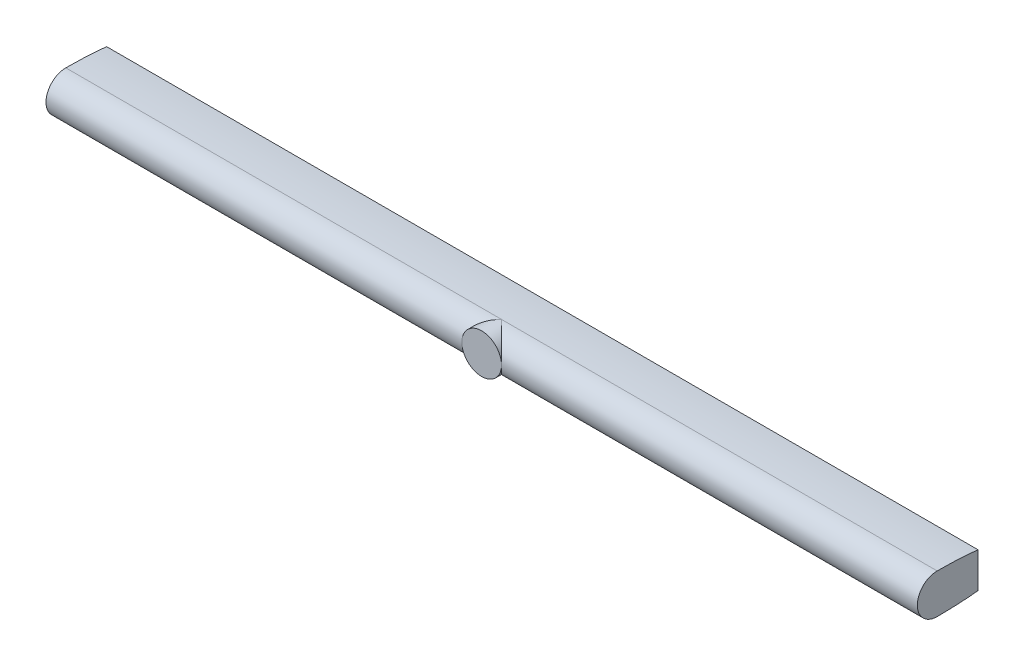
ISO-10303-21;
HEADER;
FILE_DESCRIPTION(('STEP AP214'),'2;1');
FILE_NAME('part.step','',(''),(''),'','','');
FILE_SCHEMA(('AUTOMOTIVE_DESIGN { 1 0 10303 214 1 1 1 1 }'));
ENDSEC;
DATA;
#1=APPLICATION_CONTEXT('core data for automotive mechanical design processes');
#2=APPLICATION_PROTOCOL_DEFINITION('international standard','automotive_design',2000,#1);
#3=PRODUCT_CONTEXT('',#1,'mechanical');
#4=PRODUCT('Part','Part','',(#3));
#5=PRODUCT_RELATED_PRODUCT_CATEGORY('part','',(#4));
#6=PRODUCT_DEFINITION_FORMATION('','',#4);
#7=PRODUCT_DEFINITION_CONTEXT('part definition',#1,'design');
#8=PRODUCT_DEFINITION('design','',#6,#7);
#9=PRODUCT_DEFINITION_SHAPE('','',#8);
#10=(LENGTH_UNIT() NAMED_UNIT(*) SI_UNIT(.MILLI.,.METRE.));
#11=(NAMED_UNIT(*) PLANE_ANGLE_UNIT() SI_UNIT($,.RADIAN.));
#12=(NAMED_UNIT(*) SI_UNIT($,.STERADIAN.) SOLID_ANGLE_UNIT());
#13=UNCERTAINTY_MEASURE_WITH_UNIT(LENGTH_MEASURE(1.E-05),#10,'distance_accuracy_value','');
#14=(GEOMETRIC_REPRESENTATION_CONTEXT(3) GLOBAL_UNCERTAINTY_ASSIGNED_CONTEXT((#13)) GLOBAL_UNIT_ASSIGNED_CONTEXT((#10,
#11,#12)) REPRESENTATION_CONTEXT('',''));
#15=CARTESIAN_POINT('',(0.,0.,0.));
#16=DIRECTION('',(0.,0.,1.));
#17=DIRECTION('',(1.,0.,0.));
#18=AXIS2_PLACEMENT_3D('',#15,#16,#17);
#19=CARTESIAN_POINT('',(0.,0.,29.5000000000001));
#20=DIRECTION('',(0.,0.,1.));
#21=DIRECTION('',(1.,0.,0.));
#22=AXIS2_PLACEMENT_3D('',#19,#20,#21);
#23=PLANE('',#22);
#24=CARTESIAN_POINT('',(0.,0.,29.5000000000001));
#25=DIRECTION('',(0.,0.,1.));
#26=DIRECTION('',(1.,0.,0.));
#27=AXIS2_PLACEMENT_3D('',#24,#25,#26);
#28=CIRCLE('',#27,8.);
#29=CARTESIAN_POINT('',(8.00000000000001,0.,29.5000000000001));
#30=VERTEX_POINT('',#29);
#31=CARTESIAN_POINT('',(-8.00000000000001,0.,29.5000000000001));
#32=VERTEX_POINT('',#31);
#33=EDGE_CURVE('E44',#30,#32,#28,.F.);
#34=ORIENTED_EDGE('',*,*,#33,.F.);
#35=EDGE_CURVE('E312',#32,#30,#28,.F.);
#36=ORIENTED_EDGE('',*,*,#35,.F.);
#37=EDGE_LOOP('',(#34,#36));
#38=FACE_BOUND('',#37,.T.);
#39=ADVANCED_FACE('F40',(#38),#23,.T.);
#40=CARTESIAN_POINT('',(0.,6.69328806681566E-13,15.0000000000375));
#41=DIRECTION('',(0.,0.,1.));
#42=DIRECTION('',(0.,-1.,0.));
#43=AXIS2_PLACEMENT_3D('',#40,#41,#42);
#44=PLANE('',#43);
#45=DIRECTION('',(0.,1.,0.));
#46=VECTOR('',#45,1.);
#47=CARTESIAN_POINT('',(82.5,-0.499999999999334,15.0000000000375));
#48=LINE('',#47,#46);
#49=CARTESIAN_POINT('',(82.5,-0.499999999999334,15.0000000000375));
#50=VERTEX_POINT('',#49);
#51=CARTESIAN_POINT('',(82.5,0.500000000000666,15.0000000000374));
#52=VERTEX_POINT('',#51);
#53=EDGE_CURVE('E102',#50,#52,#48,.T.);
#54=ORIENTED_EDGE('',*,*,#53,.T.);
#55=DIRECTION('',(1.,0.,0.));
#56=VECTOR('',#55,1.);
#57=CARTESIAN_POINT('',(93.5,0.500000000000666,15.0000000000374));
#58=LINE('',#57,#56);
#59=CARTESIAN_POINT('',(93.5,0.500000000000666,15.0000000000374));
#60=VERTEX_POINT('',#59);
#61=EDGE_CURVE('E111',#52,#60,#58,.T.);
#62=ORIENTED_EDGE('',*,*,#61,.T.);
#63=DIRECTION('',(0.,-1.,0.));
#64=VECTOR('',#63,1.);
#65=CARTESIAN_POINT('',(93.5,-0.499999999999334,15.0000000000375));
#66=LINE('',#65,#64);
#67=CARTESIAN_POINT('',(93.5,-0.499999999999334,15.0000000000375));
#68=VERTEX_POINT('',#67);
#69=EDGE_CURVE('E115',#60,#68,#66,.T.);
#70=ORIENTED_EDGE('',*,*,#69,.T.);
#71=DIRECTION('',(-1.,0.,0.));
#72=VECTOR('',#71,1.);
#73=CARTESIAN_POINT('',(93.5,-0.499999999999334,15.0000000000375));
#74=LINE('',#73,#72);
#75=EDGE_CURVE('E119',#68,#50,#74,.T.);
#76=ORIENTED_EDGE('',*,*,#75,.T.);
#77=EDGE_LOOP('',(#54,#62,#70,#76));
#78=FACE_BOUND('',#77,.T.);
#79=ADVANCED_FACE('F117',(#78),#44,.F.);
#80=CARTESIAN_POINT('',(0.,6.69328806681566E-13,15.0000000000375));
#81=DIRECTION('',(0.,0.,1.));
#82=DIRECTION('',(0.,-1.,0.));
#83=AXIS2_PLACEMENT_3D('',#80,#81,#82);
#84=PLANE('',#83);
#85=DIRECTION('',(0.,1.,0.));
#86=VECTOR('',#85,1.);
#87=CARTESIAN_POINT('',(-93.5,-0.499999999999334,15.0000000000375));
#88=LINE('',#87,#86);
#89=CARTESIAN_POINT('',(-93.5,-0.499999999999334,15.0000000000375));
#90=VERTEX_POINT('',#89);
#91=CARTESIAN_POINT('',(-93.5,0.500000000000666,15.0000000000374));
#92=VERTEX_POINT('',#91);
#93=EDGE_CURVE('E134',#90,#92,#88,.T.);
#94=ORIENTED_EDGE('',*,*,#93,.T.);
#95=DIRECTION('',(1.,0.,0.));
#96=VECTOR('',#95,1.);
#97=CARTESIAN_POINT('',(-82.5,0.500000000000666,15.0000000000374));
#98=LINE('',#97,#96);
#99=CARTESIAN_POINT('',(-82.5,0.500000000000666,15.0000000000374));
#100=VERTEX_POINT('',#99);
#101=EDGE_CURVE('E160',#92,#100,#98,.T.);
#102=ORIENTED_EDGE('',*,*,#101,.T.);
#103=DIRECTION('',(0.,-1.,0.));
#104=VECTOR('',#103,1.);
#105=CARTESIAN_POINT('',(-82.5,-0.499999999999334,15.0000000000375));
#106=LINE('',#105,#104);
#107=CARTESIAN_POINT('',(-82.5,-0.499999999999334,15.0000000000375));
#108=VERTEX_POINT('',#107);
#109=EDGE_CURVE('E157',#100,#108,#106,.T.);
#110=ORIENTED_EDGE('',*,*,#109,.T.);
#111=DIRECTION('',(-1.,0.,0.));
#112=VECTOR('',#111,1.);
#113=CARTESIAN_POINT('',(-82.5,-0.499999999999334,15.0000000000375));
#114=LINE('',#113,#112);
#115=EDGE_CURVE('E154',#108,#90,#114,.T.);
#116=ORIENTED_EDGE('',*,*,#115,.T.);
#117=EDGE_LOOP('',(#94,#102,#110,#116));
#118=FACE_BOUND('',#117,.T.);
#119=ADVANCED_FACE('F210',(#118),#84,.F.);
#120=CARTESIAN_POINT('',(0.,6.69328806681566E-13,15.0000000000375));
#121=DIRECTION('',(0.,0.,1.));
#122=DIRECTION('',(0.,-1.,0.));
#123=AXIS2_PLACEMENT_3D('',#120,#121,#122);
#124=PLANE('',#123);
#125=DIRECTION('',(0.,1.,0.));
#126=VECTOR('',#125,1.);
#127=CARTESIAN_POINT('',(-5.50000000000001,-0.499999999999334,15.0000000000375));
#128=LINE('',#127,#126);
#129=CARTESIAN_POINT('',(-5.50000000000001,-0.499999999999334,15.0000000000375));
#130=VERTEX_POINT('',#129);
#131=CARTESIAN_POINT('',(-5.50000000000001,0.500000000000666,15.0000000000374));
#132=VERTEX_POINT('',#131);
#133=EDGE_CURVE('E120',#130,#132,#128,.T.);
#134=ORIENTED_EDGE('',*,*,#133,.T.);
#135=DIRECTION('',(1.,0.,0.));
#136=VECTOR('',#135,1.);
#137=CARTESIAN_POINT('',(5.50000000000001,0.500000000000666,15.0000000000374));
#138=LINE('',#137,#136);
#139=CARTESIAN_POINT('',(5.50000000000001,0.500000000000666,15.0000000000374));
#140=VERTEX_POINT('',#139);
#141=EDGE_CURVE('E122',#132,#140,#138,.T.);
#142=ORIENTED_EDGE('',*,*,#141,.T.);
#143=DIRECTION('',(0.,-1.,0.));
#144=VECTOR('',#143,1.);
#145=CARTESIAN_POINT('',(5.50000000000001,-0.499999999999334,15.0000000000375));
#146=LINE('',#145,#144);
#147=CARTESIAN_POINT('',(5.50000000000001,-0.499999999999334,15.0000000000375));
#148=VERTEX_POINT('',#147);
#149=EDGE_CURVE('E144',#140,#148,#146,.T.);
#150=ORIENTED_EDGE('',*,*,#149,.T.);
#151=DIRECTION('',(-1.,0.,0.));
#152=VECTOR('',#151,1.);
#153=CARTESIAN_POINT('',(5.50000000000001,-0.499999999999334,15.0000000000375));
#154=LINE('',#153,#152);
#155=EDGE_CURVE('E141',#148,#130,#154,.T.);
#156=ORIENTED_EDGE('',*,*,#155,.T.);
#157=EDGE_LOOP('',(#134,#142,#150,#156));
#158=FACE_BOUND('',#157,.T.);
#159=ADVANCED_FACE('F213',(#158),#124,.F.);
#160=CARTESIAN_POINT('',(93.5,0.499999999999645,-7.99999999996257));
#161=DIRECTION('',(0.,-1.,0.));
#162=DIRECTION('',(0.,0.,-1.));
#163=AXIS2_PLACEMENT_3D('',#160,#161,#162);
#164=PLANE('',#163);
#165=DIRECTION('',(1.,0.,0.));
#166=VECTOR('',#165,1.);
#167=CARTESIAN_POINT('',(-192.917832605124,0.500000000000222,5.00000000003743));
#168=LINE('',#167,#166);
#169=CARTESIAN_POINT('',(82.5,0.500000000000222,5.00000000003743));
#170=VERTEX_POINT('',#169);
#171=CARTESIAN_POINT('',(93.5,0.500000000000222,5.00000000003745));
#172=VERTEX_POINT('',#171);
#173=EDGE_CURVE('E370',#170,#172,#168,.T.);
#174=ORIENTED_EDGE('',*,*,#173,.T.);
#175=DIRECTION('',(0.,0.,1.));
#176=VECTOR('',#175,1.);
#177=CARTESIAN_POINT('',(93.5,0.499999999999645,-7.99999999996257));
#178=LINE('',#177,#176);
#179=EDGE_CURVE('E91',#172,#60,#178,.T.);
#180=ORIENTED_EDGE('',*,*,#179,.T.);
#181=ORIENTED_EDGE('',*,*,#61,.F.);
#182=DIRECTION('',(0.,0.,1.));
#183=VECTOR('',#182,1.);
#184=CARTESIAN_POINT('',(82.5,0.499999999999645,-7.99999999996257));
#185=LINE('',#184,#183);
#186=EDGE_CURVE('E98',#170,#52,#185,.T.);
#187=ORIENTED_EDGE('',*,*,#186,.F.);
#188=EDGE_LOOP('',(#174,#180,#181,#187));
#189=FACE_BOUND('',#188,.T.);
#190=ADVANCED_FACE('F112',(#189),#164,.T.);
#191=CARTESIAN_POINT('',(93.5,-0.500000000000355,-7.99999999996252));
#192=DIRECTION('',(-1.,0.,0.));
#193=DIRECTION('',(0.,0.,1.));
#194=AXIS2_PLACEMENT_3D('',#191,#192,#193);
#195=PLANE('',#194);
#196=DIRECTION('',(0.,-1.,0.));
#197=VECTOR('',#196,1.);
#198=CARTESIAN_POINT('',(93.5,-7.1626297578272,5.00000000003777));
#199=LINE('',#198,#197);
#200=CARTESIAN_POINT('',(93.5,-0.499999999999778,5.00000000003748));
#201=VERTEX_POINT('',#200);
#202=EDGE_CURVE('E367',#172,#201,#199,.T.);
#203=ORIENTED_EDGE('',*,*,#202,.T.);
#204=DIRECTION('',(0.,0.,1.));
#205=VECTOR('',#204,1.);
#206=CARTESIAN_POINT('',(93.5,-0.500000000000355,-7.99999999996252));
#207=LINE('',#206,#205);
#208=EDGE_CURVE('E129',#201,#68,#207,.T.);
#209=ORIENTED_EDGE('',*,*,#208,.T.);
#210=ORIENTED_EDGE('',*,*,#69,.F.);
#211=ORIENTED_EDGE('',*,*,#179,.F.);
#212=EDGE_LOOP('',(#203,#209,#210,#211));
#213=FACE_BOUND('',#212,.T.);
#214=ADVANCED_FACE('F255',(#213),#195,.T.);
#215=CARTESIAN_POINT('',(93.5,-0.500000000000355,-7.99999999996252));
#216=DIRECTION('',(0.,1.,0.));
#217=DIRECTION('',(0.,0.,1.));
#218=AXIS2_PLACEMENT_3D('',#215,#216,#217);
#219=PLANE('',#218);
#220=DIRECTION('',(-1.,0.,0.));
#221=VECTOR('',#220,1.);
#222=CARTESIAN_POINT('',(-192.917832605124,-0.499999999999778,5.00000000003748));
#223=LINE('',#222,#221);
#224=CARTESIAN_POINT('',(82.5,-0.499999999999778,5.00000000003747));
#225=VERTEX_POINT('',#224);
#226=EDGE_CURVE('E364',#201,#225,#223,.T.);
#227=ORIENTED_EDGE('',*,*,#226,.T.);
#228=DIRECTION('',(0.,0.,1.));
#229=VECTOR('',#228,1.);
#230=CARTESIAN_POINT('',(82.5,-0.500000000000355,-7.99999999996252));
#231=LINE('',#230,#229);
#232=EDGE_CURVE('E127',#225,#50,#231,.T.);
#233=ORIENTED_EDGE('',*,*,#232,.T.);
#234=ORIENTED_EDGE('',*,*,#75,.F.);
#235=ORIENTED_EDGE('',*,*,#208,.F.);
#236=EDGE_LOOP('',(#227,#233,#234,#235));
#237=FACE_BOUND('',#236,.T.);
#238=ADVANCED_FACE('F252',(#237),#219,.T.);
#239=CARTESIAN_POINT('',(82.5,-0.500000000000355,-7.99999999996252));
#240=DIRECTION('',(1.,0.,0.));
#241=DIRECTION('',(0.,0.,-1.));
#242=AXIS2_PLACEMENT_3D('',#239,#240,#241);
#243=PLANE('',#242);
#244=DIRECTION('',(0.,1.,0.));
#245=VECTOR('',#244,1.);
#246=CARTESIAN_POINT('',(82.5,-7.1626297578272,5.00000000003777));
#247=LINE('',#246,#245);
#248=EDGE_CURVE('E106',#225,#170,#247,.T.);
#249=ORIENTED_EDGE('',*,*,#248,.T.);
#250=ORIENTED_EDGE('',*,*,#186,.T.);
#251=ORIENTED_EDGE('',*,*,#53,.F.);
#252=ORIENTED_EDGE('',*,*,#232,.F.);
#253=EDGE_LOOP('',(#249,#250,#251,#252));
#254=FACE_BOUND('',#253,.T.);
#255=ADVANCED_FACE('F99',(#254),#243,.T.);
#256=CARTESIAN_POINT('',(-82.5,0.499999999999645,-7.99999999996257));
#257=DIRECTION('',(0.,-1.,0.));
#258=DIRECTION('',(0.,0.,-1.));
#259=AXIS2_PLACEMENT_3D('',#256,#257,#258);
#260=PLANE('',#259);
#261=DIRECTION('',(1.,0.,0.));
#262=VECTOR('',#261,1.);
#263=CARTESIAN_POINT('',(-192.917832605124,0.500000000000222,5.00000000003743));
#264=LINE('',#263,#262);
#265=CARTESIAN_POINT('',(-93.5,0.500000000000222,5.00000000003743));
#266=VERTEX_POINT('',#265);
#267=CARTESIAN_POINT('',(-82.5,0.500000000000222,5.00000000003745));
#268=VERTEX_POINT('',#267);
#269=EDGE_CURVE('E344',#266,#268,#264,.T.);
#270=ORIENTED_EDGE('',*,*,#269,.T.);
#271=DIRECTION('',(0.,0.,1.));
#272=VECTOR('',#271,1.);
#273=CARTESIAN_POINT('',(-82.5,0.499999999999645,-7.99999999996257));
#274=LINE('',#273,#272);
#275=EDGE_CURVE('E50',#268,#100,#274,.T.);
#276=ORIENTED_EDGE('',*,*,#275,.T.);
#277=ORIENTED_EDGE('',*,*,#101,.F.);
#278=DIRECTION('',(0.,0.,1.));
#279=VECTOR('',#278,1.);
#280=CARTESIAN_POINT('',(-93.5,0.499999999999645,-7.99999999996257));
#281=LINE('',#280,#279);
#282=EDGE_CURVE('E11',#266,#92,#281,.T.);
#283=ORIENTED_EDGE('',*,*,#282,.F.);
#284=EDGE_LOOP('',(#270,#276,#277,#283));
#285=FACE_BOUND('',#284,.T.);
#286=ADVANCED_FACE('F222',(#285),#260,.T.);
#287=CARTESIAN_POINT('',(-82.5,-0.500000000000355,-7.99999999996252));
#288=DIRECTION('',(-1.,0.,0.));
#289=DIRECTION('',(0.,0.,1.));
#290=AXIS2_PLACEMENT_3D('',#287,#288,#289);
#291=PLANE('',#290);
#292=DIRECTION('',(0.,-1.,0.));
#293=VECTOR('',#292,1.);
#294=CARTESIAN_POINT('',(-82.5,-7.1626297578272,5.00000000003777));
#295=LINE('',#294,#293);
#296=CARTESIAN_POINT('',(-82.5,-0.499999999999778,5.00000000003748));
#297=VERTEX_POINT('',#296);
#298=EDGE_CURVE('E340',#268,#297,#295,.T.);
#299=ORIENTED_EDGE('',*,*,#298,.T.);
#300=DIRECTION('',(0.,0.,1.));
#301=VECTOR('',#300,1.);
#302=CARTESIAN_POINT('',(-82.5,-0.500000000000355,-7.99999999996252));
#303=LINE('',#302,#301);
#304=EDGE_CURVE('E151',#297,#108,#303,.T.);
#305=ORIENTED_EDGE('',*,*,#304,.T.);
#306=ORIENTED_EDGE('',*,*,#109,.F.);
#307=ORIENTED_EDGE('',*,*,#275,.F.);
#308=EDGE_LOOP('',(#299,#305,#306,#307));
#309=FACE_BOUND('',#308,.T.);
#310=ADVANCED_FACE('F219',(#309),#291,.T.);
#311=CARTESIAN_POINT('',(-82.5,-0.500000000000355,-7.99999999996252));
#312=DIRECTION('',(0.,1.,0.));
#313=DIRECTION('',(0.,0.,1.));
#314=AXIS2_PLACEMENT_3D('',#311,#312,#313);
#315=PLANE('',#314);
#316=DIRECTION('',(-1.,0.,0.));
#317=VECTOR('',#316,1.);
#318=CARTESIAN_POINT('',(-192.917832605124,-0.499999999999778,5.00000000003748));
#319=LINE('',#318,#317);
#320=CARTESIAN_POINT('',(-93.5,-0.499999999999778,5.00000000003747));
#321=VERTEX_POINT('',#320);
#322=EDGE_CURVE('E335',#297,#321,#319,.T.);
#323=ORIENTED_EDGE('',*,*,#322,.T.);
#324=DIRECTION('',(0.,0.,1.));
#325=VECTOR('',#324,1.);
#326=CARTESIAN_POINT('',(-93.5,-0.500000000000355,-7.99999999996252));
#327=LINE('',#326,#325);
#328=EDGE_CURVE('E59',#321,#90,#327,.T.);
#329=ORIENTED_EDGE('',*,*,#328,.T.);
#330=ORIENTED_EDGE('',*,*,#115,.F.);
#331=ORIENTED_EDGE('',*,*,#304,.F.);
#332=EDGE_LOOP('',(#323,#329,#330,#331));
#333=FACE_BOUND('',#332,.T.);
#334=ADVANCED_FACE('F215',(#333),#315,.T.);
#335=CARTESIAN_POINT('',(-93.5,-0.500000000000355,-7.99999999996252));
#336=DIRECTION('',(1.,0.,0.));
#337=DIRECTION('',(0.,0.,-1.));
#338=AXIS2_PLACEMENT_3D('',#335,#336,#337);
#339=PLANE('',#338);
#340=DIRECTION('',(0.,1.,0.));
#341=VECTOR('',#340,1.);
#342=CARTESIAN_POINT('',(-93.5,-7.1626297578272,5.00000000003777));
#343=LINE('',#342,#341);
#344=EDGE_CURVE('E349',#321,#266,#343,.T.);
#345=ORIENTED_EDGE('',*,*,#344,.T.);
#346=ORIENTED_EDGE('',*,*,#282,.T.);
#347=ORIENTED_EDGE('',*,*,#93,.F.);
#348=ORIENTED_EDGE('',*,*,#328,.F.);
#349=EDGE_LOOP('',(#345,#346,#347,#348));
#350=FACE_BOUND('',#349,.T.);
#351=ADVANCED_FACE('F218',(#350),#339,.T.);
#352=CARTESIAN_POINT('',(5.50000000000001,0.499999999999645,-7.99999999996257));
#353=DIRECTION('',(0.,-1.,0.));
#354=DIRECTION('',(0.,0.,-1.));
#355=AXIS2_PLACEMENT_3D('',#352,#353,#354);
#356=PLANE('',#355);
#357=DIRECTION('',(1.,0.,0.));
#358=VECTOR('',#357,1.);
#359=CARTESIAN_POINT('',(-192.917832605124,0.500000000000222,5.00000000003743));
#360=LINE('',#359,#358);
#361=CARTESIAN_POINT('',(-5.50000000000001,0.500000000000222,5.00000000003743));
#362=VERTEX_POINT('',#361);
#363=CARTESIAN_POINT('',(5.50000000000001,0.500000000000222,5.00000000003745));
#364=VERTEX_POINT('',#363);
#365=EDGE_CURVE('E358',#362,#364,#360,.T.);
#366=ORIENTED_EDGE('',*,*,#365,.T.);
#367=DIRECTION('',(0.,0.,1.));
#368=VECTOR('',#367,1.);
#369=CARTESIAN_POINT('',(5.50000000000001,0.499999999999645,-7.99999999996257));
#370=LINE('',#369,#368);
#371=EDGE_CURVE('E135',#364,#140,#370,.T.);
#372=ORIENTED_EDGE('',*,*,#371,.T.);
#373=ORIENTED_EDGE('',*,*,#141,.F.);
#374=DIRECTION('',(0.,0.,1.));
#375=VECTOR('',#374,1.);
#376=CARTESIAN_POINT('',(-5.50000000000001,0.499999999999645,-7.99999999996257));
#377=LINE('',#376,#375);
#378=EDGE_CURVE('E132',#362,#132,#377,.T.);
#379=ORIENTED_EDGE('',*,*,#378,.F.);
#380=EDGE_LOOP('',(#366,#372,#373,#379));
#381=FACE_BOUND('',#380,.T.);
#382=ADVANCED_FACE('F229',(#381),#356,.T.);
#383=CARTESIAN_POINT('',(5.50000000000001,-0.500000000000355,-7.99999999996252));
#384=DIRECTION('',(-1.,0.,0.));
#385=DIRECTION('',(0.,0.,1.));
#386=AXIS2_PLACEMENT_3D('',#383,#384,#385);
#387=PLANE('',#386);
#388=DIRECTION('',(0.,-1.,0.));
#389=VECTOR('',#388,1.);
#390=CARTESIAN_POINT('',(5.50000000000001,-7.1626297578272,5.00000000003777));
#391=LINE('',#390,#389);
#392=CARTESIAN_POINT('',(5.50000000000001,-0.499999999999778,5.00000000003748));
#393=VERTEX_POINT('',#392);
#394=EDGE_CURVE('E355',#364,#393,#391,.T.);
#395=ORIENTED_EDGE('',*,*,#394,.T.);
#396=DIRECTION('',(0.,0.,1.));
#397=VECTOR('',#396,1.);
#398=CARTESIAN_POINT('',(5.50000000000001,-0.500000000000355,-7.99999999996252));
#399=LINE('',#398,#397);
#400=EDGE_CURVE('E137',#393,#148,#399,.T.);
#401=ORIENTED_EDGE('',*,*,#400,.T.);
#402=ORIENTED_EDGE('',*,*,#149,.F.);
#403=ORIENTED_EDGE('',*,*,#371,.F.);
#404=EDGE_LOOP('',(#395,#401,#402,#403));
#405=FACE_BOUND('',#404,.T.);
#406=ADVANCED_FACE('F238',(#405),#387,.T.);
#407=CARTESIAN_POINT('',(5.50000000000001,-0.500000000000355,-7.99999999996252));
#408=DIRECTION('',(0.,1.,0.));
#409=DIRECTION('',(0.,0.,1.));
#410=AXIS2_PLACEMENT_3D('',#407,#408,#409);
#411=PLANE('',#410);
#412=DIRECTION('',(-1.,0.,0.));
#413=VECTOR('',#412,1.);
#414=CARTESIAN_POINT('',(-192.917832605124,-0.499999999999778,5.00000000003748));
#415=LINE('',#414,#413);
#416=CARTESIAN_POINT('',(-5.50000000000001,-0.499999999999778,5.00000000003747));
#417=VERTEX_POINT('',#416);
#418=EDGE_CURVE('E352',#393,#417,#415,.T.);
#419=ORIENTED_EDGE('',*,*,#418,.T.);
#420=DIRECTION('',(0.,0.,1.));
#421=VECTOR('',#420,1.);
#422=CARTESIAN_POINT('',(-5.50000000000001,-0.500000000000355,-7.99999999996252));
#423=LINE('',#422,#421);
#424=EDGE_CURVE('E139',#417,#130,#423,.T.);
#425=ORIENTED_EDGE('',*,*,#424,.T.);
#426=ORIENTED_EDGE('',*,*,#155,.F.);
#427=ORIENTED_EDGE('',*,*,#400,.F.);
#428=EDGE_LOOP('',(#419,#425,#426,#427));
#429=FACE_BOUND('',#428,.T.);
#430=ADVANCED_FACE('F234',(#429),#411,.T.);
#431=CARTESIAN_POINT('',(-5.50000000000001,-0.500000000000355,-7.99999999996252));
#432=DIRECTION('',(1.,0.,0.));
#433=DIRECTION('',(0.,0.,-1.));
#434=AXIS2_PLACEMENT_3D('',#431,#432,#433);
#435=PLANE('',#434);
#436=DIRECTION('',(0.,1.,0.));
#437=VECTOR('',#436,1.);
#438=CARTESIAN_POINT('',(-5.50000000000001,-7.1626297578272,5.00000000003777));
#439=LINE('',#438,#437);
#440=EDGE_CURVE('E361',#417,#362,#439,.T.);
#441=ORIENTED_EDGE('',*,*,#440,.T.);
#442=ORIENTED_EDGE('',*,*,#378,.T.);
#443=ORIENTED_EDGE('',*,*,#133,.F.);
#444=ORIENTED_EDGE('',*,*,#424,.F.);
#445=EDGE_LOOP('',(#441,#442,#443,#444));
#446=FACE_BOUND('',#445,.T.);
#447=ADVANCED_FACE('F237',(#446),#435,.T.);
#448=CARTESIAN_POINT('',(-192.917832605124,-7.1626297578272,5.00000000003777));
#449=DIRECTION('',(0.,0.,1.));
#450=DIRECTION('',(0.,-1.,0.));
#451=AXIS2_PLACEMENT_3D('',#448,#449,#450);
#452=PLANE('',#451);
#453=ORIENTED_EDGE('',*,*,#440,.F.);
#454=ORIENTED_EDGE('',*,*,#418,.F.);
#455=ORIENTED_EDGE('',*,*,#394,.F.);
#456=ORIENTED_EDGE('',*,*,#365,.F.);
#457=EDGE_LOOP('',(#453,#454,#455,#456));
#458=FACE_BOUND('',#457,.T.);
#459=DIRECTION('',(0.,1.,0.));
#460=VECTOR('',#459,1.);
#461=CARTESIAN_POINT('',(-176.,-7.1626297578272,5.00000000003777));
#462=LINE('',#461,#460);
#463=CARTESIAN_POINT('',(-176.,-7.16262975778915,5.00000000003775));
#464=VERTEX_POINT('',#463);
#465=CARTESIAN_POINT('',(-176.,7.16262975788814,5.00000000003714));
#466=VERTEX_POINT('',#465);
#467=EDGE_CURVE('E171',#464,#466,#462,.T.);
#468=ORIENTED_EDGE('',*,*,#467,.T.);
#469=DIRECTION('',(1.,0.,0.));
#470=VECTOR('',#469,1.);
#471=CARTESIAN_POINT('',(-192.917832605124,7.16262975788814,5.00000000003714));
#472=LINE('',#471,#470);
#473=CARTESIAN_POINT('',(176.,7.16262975788814,5.00000000003714));
#474=VERTEX_POINT('',#473);
#475=EDGE_CURVE('E329',#466,#474,#472,.T.);
#476=ORIENTED_EDGE('',*,*,#475,.T.);
#477=DIRECTION('',(0.,-1.,0.));
#478=VECTOR('',#477,1.);
#479=CARTESIAN_POINT('',(176.,-7.1626297578272,5.00000000003777));
#480=LINE('',#479,#478);
#481=CARTESIAN_POINT('',(176.,-7.16262975299486,4.99999995242817));
#482=VERTEX_POINT('',#481);
#483=EDGE_CURVE('E332',#474,#482,#480,.T.);
#484=ORIENTED_EDGE('',*,*,#483,.T.);
#485=DIRECTION('',(1.,0.,0.));
#486=VECTOR('',#485,1.);
#487=CARTESIAN_POINT('',(-192.917832605124,-7.16262975299486,4.99999995242817));
#488=LINE('',#487,#486);
#489=EDGE_CURVE('E181',#464,#482,#488,.T.);
#490=ORIENTED_EDGE('',*,*,#489,.F.);
#491=EDGE_LOOP('',(#468,#476,#484,#490));
#492=FACE_BOUND('',#491,.T.);
#493=ORIENTED_EDGE('',*,*,#344,.F.);
#494=ORIENTED_EDGE('',*,*,#322,.F.);
#495=ORIENTED_EDGE('',*,*,#298,.F.);
#496=ORIENTED_EDGE('',*,*,#269,.F.);
#497=EDGE_LOOP('',(#493,#494,#495,#496));
#498=FACE_BOUND('',#497,.T.);
#499=ORIENTED_EDGE('',*,*,#248,.F.);
#500=ORIENTED_EDGE('',*,*,#226,.F.);
#501=ORIENTED_EDGE('',*,*,#202,.F.);
#502=ORIENTED_EDGE('',*,*,#173,.F.);
#503=EDGE_LOOP('',(#499,#500,#501,#502));
#504=FACE_BOUND('',#503,.T.);
#505=ADVANCED_FACE('F248',(#458,#492,#498,#504),#452,.F.);
#506=CARTESIAN_POINT('',(176.,-8.,21.5000000000001));
#507=CARTESIAN_POINT('',(176.,-7.99999999999967,-3.99999999999997));
#508=CARTESIAN_POINT('',(176.,0.,-29.5));
#509=B_SPLINE_CURVE_WITH_KNOTS('',2,(#506,#507,#508),.UNSPECIFIED.,.F.,.F.,(3,3),(0.,1.),.UNSPECIFIED.);
#510=DIRECTION('',(-1.,0.,0.));
#511=VECTOR('',#510,1.);
#512=SURFACE_OF_LINEAR_EXTRUSION('',#509,#511);
#513=CARTESIAN_POINT('',(-176.,-8.,21.5000000000001));
#514=CARTESIAN_POINT('',(-176.,-7.99999999999967,-3.99999999999997));
#515=CARTESIAN_POINT('',(-176.,0.,-29.5));
#516=B_SPLINE_CURVE_WITH_KNOTS('',2,(#513,#514,#515),.UNSPECIFIED.,.F.,.F.,(3,3),(0.,1.),.UNSPECIFIED.);
#517=CARTESIAN_POINT('',(-176.,-8.,21.5000000000001));
#518=VERTEX_POINT('',#517);
#519=EDGE_CURVE('E172',#518,#464,#516,.T.);
#520=ORIENTED_EDGE('',*,*,#519,.T.);
#521=ORIENTED_EDGE('',*,*,#489,.T.);
#522=CARTESIAN_POINT('',(176.,-8.,21.5000000000001));
#523=VERTEX_POINT('',#522);
#524=EDGE_CURVE('E170',#523,#482,#509,.T.);
#525=ORIENTED_EDGE('',*,*,#524,.F.);
#526=DIRECTION('',(-1.,0.,0.));
#527=VECTOR('',#526,1.);
#528=CARTESIAN_POINT('',(176.,-8.,21.5000000000001));
#529=LINE('',#528,#527);
#530=CARTESIAN_POINT('',(0.,-8.,21.5000000000001));
#531=VERTEX_POINT('',#530);
#532=EDGE_CURVE('E319',#523,#531,#529,.T.);
#533=ORIENTED_EDGE('',*,*,#532,.T.);
#534=EDGE_CURVE('E299',#531,#518,#529,.T.);
#535=ORIENTED_EDGE('',*,*,#534,.T.);
#536=EDGE_LOOP('',(#520,#521,#525,#533,#535));
#537=FACE_BOUND('',#536,.T.);
#538=ADVANCED_FACE('F208',(#537),#512,.F.);
#539=CARTESIAN_POINT('',(-176.,5.99999999999984,-3.99999999999997));
#540=DIRECTION('',(1.,0.,0.));
#541=DIRECTION('',(0.,0.,-1.));
#542=AXIS2_PLACEMENT_3D('',#539,#540,#541);
#543=PLANE('',#542);
#544=CARTESIAN_POINT('',(-176.,8.,21.5000000000001));
#545=CARTESIAN_POINT('',(-176.,7.99999999999967,-3.99999999999997));
#546=CARTESIAN_POINT('',(-176.,0.,-29.5));
#547=B_SPLINE_CURVE_WITH_KNOTS('',2,(#544,#545,#546),.UNSPECIFIED.,.F.,.F.,(3,3),(0.,1.),.UNSPECIFIED.);
#548=CARTESIAN_POINT('',(-176.,8.,21.5000000000001));
#549=VERTEX_POINT('',#548);
#550=EDGE_CURVE('E165',#549,#466,#547,.T.);
#551=ORIENTED_EDGE('',*,*,#550,.T.);
#552=ORIENTED_EDGE('',*,*,#467,.F.);
#553=ORIENTED_EDGE('',*,*,#519,.F.);
#554=CARTESIAN_POINT('',(-176.,0.,21.5000000000001));
#555=DIRECTION('',(1.,0.,0.));
#556=DIRECTION('',(0.,0.,-1.));
#557=AXIS2_PLACEMENT_3D('',#554,#555,#556);
#558=CIRCLE('',#557,8.);
#559=EDGE_CURVE('E180',#549,#518,#558,.T.);
#560=ORIENTED_EDGE('',*,*,#559,.F.);
#561=EDGE_LOOP('',(#551,#552,#553,#560));
#562=FACE_BOUND('',#561,.T.);
#563=ADVANCED_FACE('F284',(#562),#543,.F.);
#564=CARTESIAN_POINT('',(0.,0.,-29.501));
#565=DIRECTION('',(0.,0.,1.));
#566=DIRECTION('',(1.,0.,0.));
#567=AXIS2_PLACEMENT_3D('',#564,#565,#566);
#568=CYLINDRICAL_SURFACE('',#567,8.);
#569=CARTESIAN_POINT('',(0.,0.,21.5000000000001));
#570=DIRECTION('',(-0.707106781186547,0.,0.707106781186547));
#571=DIRECTION('',(0.707106781186547,0.,0.707106781186547));
#572=AXIS2_PLACEMENT_3D('',#569,#570,#571);
#573=ELLIPSE('',#572,11.3137084989848,8.);
#574=EDGE_CURVE('E315',#531,#30,#573,.T.);
#575=ORIENTED_EDGE('',*,*,#574,.T.);
#576=ORIENTED_EDGE('',*,*,#33,.T.);
#577=CARTESIAN_POINT('',(0.,0.,21.5000000000001));
#578=DIRECTION('',(0.707106781186547,0.,0.707106781186547));
#579=DIRECTION('',(-0.707106781186547,0.,0.707106781186547));
#580=AXIS2_PLACEMENT_3D('',#577,#578,#579);
#581=ELLIPSE('',#580,11.3137084989848,8.);
#582=EDGE_CURVE('E108',#32,#531,#581,.T.);
#583=ORIENTED_EDGE('',*,*,#582,.T.);
#584=EDGE_LOOP('',(#575,#576,#583));
#585=FACE_BOUND('',#584,.T.);
#586=ADVANCED_FACE('F42',(#585),#568,.T.);
#587=CARTESIAN_POINT('',(176.,0.,21.5000000000001));
#588=DIRECTION('',(-1.,0.,0.));
#589=DIRECTION('',(0.,0.,1.));
#590=AXIS2_PLACEMENT_3D('',#587,#588,#589);
#591=CYLINDRICAL_SURFACE('',#590,8.);
#592=ORIENTED_EDGE('',*,*,#582,.F.);
#593=CARTESIAN_POINT('',(0.,8.,21.5000000000001));
#594=VERTEX_POINT('',#593);
#595=EDGE_CURVE('E294',#594,#32,#581,.T.);
#596=ORIENTED_EDGE('',*,*,#595,.F.);
#597=DIRECTION('',(-1.,0.,0.));
#598=VECTOR('',#597,1.);
#599=CARTESIAN_POINT('',(176.,8.,21.5000000000001));
#600=LINE('',#599,#598);
#601=EDGE_CURVE('E192',#594,#549,#600,.T.);
#602=ORIENTED_EDGE('',*,*,#601,.T.);
#603=ORIENTED_EDGE('',*,*,#559,.T.);
#604=ORIENTED_EDGE('',*,*,#534,.F.);
#605=EDGE_LOOP('',(#592,#596,#602,#603,#604));
#606=FACE_BOUND('',#605,.T.);
#607=ADVANCED_FACE('F206',(#606),#591,.T.);
#608=CARTESIAN_POINT('',(176.,8.,21.5000000000001));
#609=CARTESIAN_POINT('',(176.,7.99999999999967,-3.99999999999997));
#610=CARTESIAN_POINT('',(176.,0.,-29.5));
#611=B_SPLINE_CURVE_WITH_KNOTS('',2,(#608,#609,#610),.UNSPECIFIED.,.F.,.F.,(3,3),(0.,1.),.UNSPECIFIED.);
#612=DIRECTION('',(-1.,0.,0.));
#613=VECTOR('',#612,1.);
#614=SURFACE_OF_LINEAR_EXTRUSION('',#611,#613);
#615=ORIENTED_EDGE('',*,*,#475,.F.);
#616=ORIENTED_EDGE('',*,*,#550,.F.);
#617=ORIENTED_EDGE('',*,*,#601,.F.);
#618=CARTESIAN_POINT('',(176.,8.,21.5000000000001));
#619=VERTEX_POINT('',#618);
#620=EDGE_CURVE('E191',#619,#594,#600,.T.);
#621=ORIENTED_EDGE('',*,*,#620,.F.);
#622=EDGE_CURVE('E182',#619,#474,#611,.T.);
#623=ORIENTED_EDGE('',*,*,#622,.T.);
#624=EDGE_LOOP('',(#615,#616,#617,#621,#623));
#625=FACE_BOUND('',#624,.T.);
#626=ADVANCED_FACE('F201',(#625),#614,.T.);
#627=ORIENTED_EDGE('',*,*,#595,.T.);
#628=ORIENTED_EDGE('',*,*,#35,.T.);
#629=EDGE_CURVE('E314',#30,#594,#573,.T.);
#630=ORIENTED_EDGE('',*,*,#629,.T.);
#631=EDGE_LOOP('',(#627,#628,#630));
#632=FACE_BOUND('',#631,.T.);
#633=ADVANCED_FACE('F205',(#632),#568,.T.);
#634=CARTESIAN_POINT('',(176.,5.99999999999984,-3.99999999999997));
#635=DIRECTION('',(1.,0.,0.));
#636=DIRECTION('',(0.,0.,-1.));
#637=AXIS2_PLACEMENT_3D('',#634,#635,#636);
#638=PLANE('',#637);
#639=ORIENTED_EDGE('',*,*,#483,.F.);
#640=ORIENTED_EDGE('',*,*,#622,.F.);
#641=CARTESIAN_POINT('',(176.,0.,21.5000000000001));
#642=DIRECTION('',(1.,0.,0.));
#643=DIRECTION('',(0.,0.,-1.));
#644=AXIS2_PLACEMENT_3D('',#641,#642,#643);
#645=CIRCLE('',#644,8.);
#646=EDGE_CURVE('E324',#619,#523,#645,.T.);
#647=ORIENTED_EDGE('',*,*,#646,.T.);
#648=ORIENTED_EDGE('',*,*,#524,.T.);
#649=EDGE_LOOP('',(#639,#640,#647,#648));
#650=FACE_BOUND('',#649,.T.);
#651=ADVANCED_FACE('F270',(#650),#638,.T.);
#652=ORIENTED_EDGE('',*,*,#532,.F.);
#653=ORIENTED_EDGE('',*,*,#646,.F.);
#654=ORIENTED_EDGE('',*,*,#620,.T.);
#655=ORIENTED_EDGE('',*,*,#629,.F.);
#656=ORIENTED_EDGE('',*,*,#574,.F.);
#657=EDGE_LOOP('',(#652,#653,#654,#655,#656));
#658=FACE_BOUND('',#657,.T.);
#659=ADVANCED_FACE('F265',(#658),#591,.T.);
#660=CLOSED_SHELL('',(#39,#79,#119,#159,#190,#214,#238,#255,#286,#310,#334,#351,#382,#406,#430,
#447,#505,#538,#563,#586,#607,#626,#633,#651,#659));
#661=MANIFOLD_SOLID_BREP('B2',#660);
#662=ADVANCED_BREP_SHAPE_REPRESENTATION('',(#18,#661),#14);
#663=SHAPE_DEFINITION_REPRESENTATION(#9,#662);
ENDSEC;
END-ISO-10303-21;
